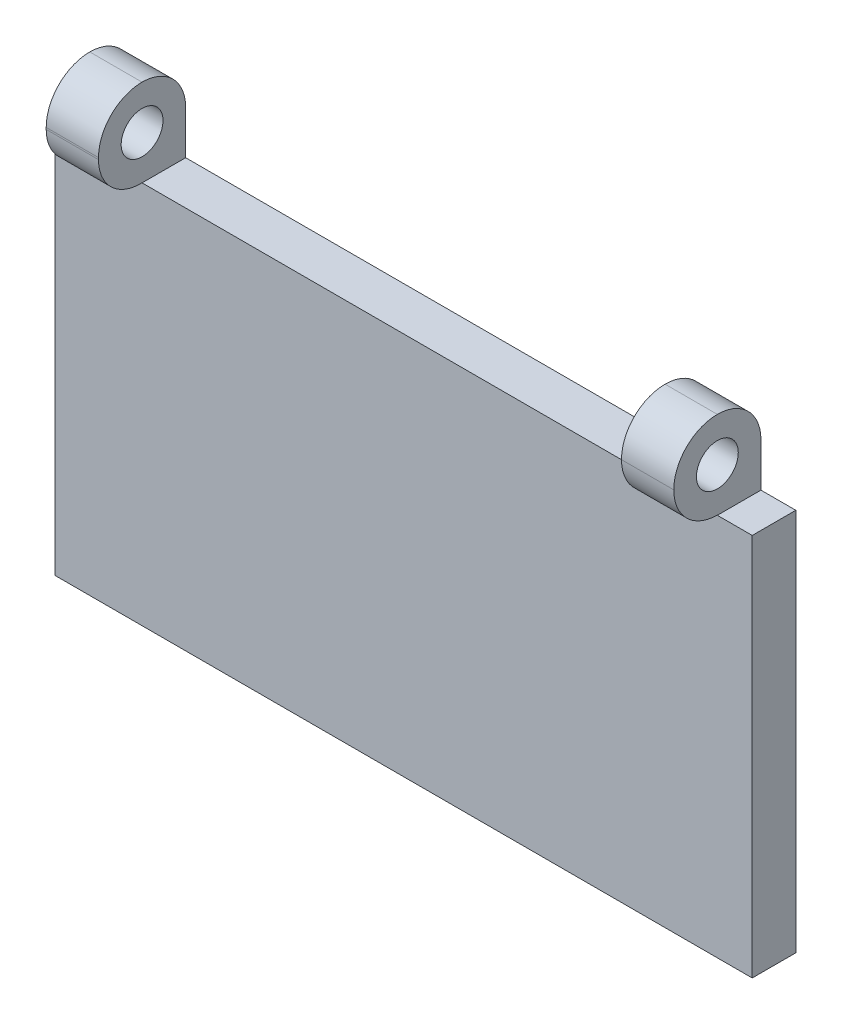
ISO-10303-21;
HEADER;
FILE_DESCRIPTION(('STEP AP214'),'2;1');
FILE_NAME('part.step','',(''),(''),'','','');
FILE_SCHEMA(('AUTOMOTIVE_DESIGN { 1 0 10303 214 1 1 1 1 }'));
ENDSEC;
DATA;
#1=APPLICATION_CONTEXT('core data for automotive mechanical design processes');
#2=APPLICATION_PROTOCOL_DEFINITION('international standard','automotive_design',2000,#1);
#3=PRODUCT_CONTEXT('',#1,'mechanical');
#4=PRODUCT('Part','Part','',(#3));
#5=PRODUCT_RELATED_PRODUCT_CATEGORY('part','',(#4));
#6=PRODUCT_DEFINITION_FORMATION('','',#4);
#7=PRODUCT_DEFINITION_CONTEXT('part definition',#1,'design');
#8=PRODUCT_DEFINITION('design','',#6,#7);
#9=PRODUCT_DEFINITION_SHAPE('','',#8);
#10=(LENGTH_UNIT() NAMED_UNIT(*) SI_UNIT(.MILLI.,.METRE.));
#11=(NAMED_UNIT(*) PLANE_ANGLE_UNIT() SI_UNIT($,.RADIAN.));
#12=(NAMED_UNIT(*) SI_UNIT($,.STERADIAN.) SOLID_ANGLE_UNIT());
#13=UNCERTAINTY_MEASURE_WITH_UNIT(LENGTH_MEASURE(1.E-05),#10,'distance_accuracy_value','');
#14=(GEOMETRIC_REPRESENTATION_CONTEXT(3) GLOBAL_UNCERTAINTY_ASSIGNED_CONTEXT((#13)) GLOBAL_UNIT_ASSIGNED_CONTEXT((#10,
#11,#12)) REPRESENTATION_CONTEXT('',''));
#15=CARTESIAN_POINT('',(0.,0.,0.));
#16=DIRECTION('',(0.,0.,1.));
#17=DIRECTION('',(1.,0.,0.));
#18=AXIS2_PLACEMENT_3D('',#15,#16,#17);
#19=CARTESIAN_POINT('',(18.,22.075,2.5));
#20=DIRECTION('',(-1.,0.,0.));
#21=DIRECTION('',(0.,0.,1.));
#22=AXIS2_PLACEMENT_3D('',#19,#20,#21);
#23=CYLINDRICAL_SURFACE('',#22,1.2);
#24=CARTESIAN_POINT('',(15.,22.075,2.5));
#25=DIRECTION('',(1.,0.,0.));
#26=DIRECTION('',(0.,0.,-1.));
#27=AXIS2_PLACEMENT_3D('',#24,#25,#26);
#28=CIRCLE('',#27,1.2);
#29=CARTESIAN_POINT('',(15.,22.075,1.3));
#30=VERTEX_POINT('',#29);
#31=EDGE_CURVE('E189',#30,#30,#28,.F.);
#32=ORIENTED_EDGE('',*,*,#31,.T.);
#33=EDGE_LOOP('',(#32));
#34=FACE_BOUND('',#33,.T.);
#35=CARTESIAN_POINT('',(18.,22.075,2.5));
#36=DIRECTION('',(1.,0.,0.));
#37=DIRECTION('',(0.,0.,-1.));
#38=AXIS2_PLACEMENT_3D('',#35,#36,#37);
#39=CIRCLE('',#38,1.2);
#40=CARTESIAN_POINT('',(18.,22.075,1.3));
#41=VERTEX_POINT('',#40);
#42=EDGE_CURVE('E299',#41,#41,#39,.F.);
#43=ORIENTED_EDGE('',*,*,#42,.F.);
#44=EDGE_LOOP('',(#43));
#45=FACE_BOUND('',#44,.T.);
#46=ADVANCED_FACE('F34',(#34,#45),#23,.F.);
#47=CARTESIAN_POINT('',(20.,22.075,2.5));
#48=DIRECTION('',(-1.,0.,0.));
#49=DIRECTION('',(0.,-1.,0.));
#50=AXIS2_PLACEMENT_3D('',#47,#48,#49);
#51=CYLINDRICAL_SURFACE('',#50,2.5);
#52=DIRECTION('',(-1.,0.,0.));
#53=VECTOR('',#52,1.);
#54=CARTESIAN_POINT('',(20.,24.575,2.5));
#55=LINE('',#54,#53);
#56=CARTESIAN_POINT('',(18.,24.575,2.5));
#57=VERTEX_POINT('',#56);
#58=CARTESIAN_POINT('',(15.,24.575,2.5));
#59=VERTEX_POINT('',#58);
#60=EDGE_CURVE('E226',#57,#59,#55,.T.);
#61=ORIENTED_EDGE('',*,*,#60,.F.);
#62=CARTESIAN_POINT('',(18.,22.075,2.5));
#63=DIRECTION('',(1.,0.,0.));
#64=DIRECTION('',(0.,0.,-1.));
#65=AXIS2_PLACEMENT_3D('',#62,#63,#64);
#66=CIRCLE('',#65,2.5);
#67=CARTESIAN_POINT('',(18.,22.075,0.));
#68=VERTEX_POINT('',#67);
#69=EDGE_CURVE('E310',#57,#68,#66,.F.);
#70=ORIENTED_EDGE('',*,*,#69,.T.);
#71=DIRECTION('',(-1.,0.,0.));
#72=VECTOR('',#71,1.);
#73=CARTESIAN_POINT('',(0.,22.075,0.));
#74=LINE('',#73,#72);
#75=CARTESIAN_POINT('',(15.,22.075,0.));
#76=VERTEX_POINT('',#75);
#77=EDGE_CURVE('E218',#76,#68,#74,.F.);
#78=ORIENTED_EDGE('',*,*,#77,.F.);
#79=CARTESIAN_POINT('',(15.,22.075,2.5));
#80=DIRECTION('',(1.,0.,0.));
#81=DIRECTION('',(0.,0.,-1.));
#82=AXIS2_PLACEMENT_3D('',#79,#80,#81);
#83=CIRCLE('',#82,2.5);
#84=EDGE_CURVE('E266',#59,#76,#83,.F.);
#85=ORIENTED_EDGE('',*,*,#84,.F.);
#86=EDGE_LOOP('',(#61,#70,#78,#85));
#87=FACE_BOUND('',#86,.T.);
#88=ADVANCED_FACE('F36',(#87),#51,.T.);
#89=CARTESIAN_POINT('',(20.,22.075,2.5));
#90=DIRECTION('',(-1.,0.,0.));
#91=DIRECTION('',(0.,-1.,0.));
#92=AXIS2_PLACEMENT_3D('',#89,#90,#91);
#93=CYLINDRICAL_SURFACE('',#92,2.5);
#94=DIRECTION('',(-1.,0.,0.));
#95=VECTOR('',#94,1.);
#96=CARTESIAN_POINT('',(20.,22.075,5.));
#97=LINE('',#96,#95);
#98=CARTESIAN_POINT('',(18.,22.075,5.));
#99=VERTEX_POINT('',#98);
#100=CARTESIAN_POINT('',(15.,22.075,5.));
#101=VERTEX_POINT('',#100);
#102=EDGE_CURVE('E227',#99,#101,#97,.T.);
#103=ORIENTED_EDGE('',*,*,#102,.F.);
#104=CARTESIAN_POINT('',(18.,22.075,2.5));
#105=DIRECTION('',(1.,0.,0.));
#106=DIRECTION('',(0.,0.,-1.));
#107=AXIS2_PLACEMENT_3D('',#104,#105,#106);
#108=CIRCLE('',#107,2.5);
#109=EDGE_CURVE('E313',#99,#57,#108,.F.);
#110=ORIENTED_EDGE('',*,*,#109,.T.);
#111=ORIENTED_EDGE('',*,*,#60,.T.);
#112=CARTESIAN_POINT('',(15.,22.075,2.5));
#113=DIRECTION('',(1.,0.,0.));
#114=DIRECTION('',(0.,0.,-1.));
#115=AXIS2_PLACEMENT_3D('',#112,#113,#114);
#116=CIRCLE('',#115,2.5);
#117=EDGE_CURVE('E195',#101,#59,#116,.F.);
#118=ORIENTED_EDGE('',*,*,#117,.F.);
#119=EDGE_LOOP('',(#103,#110,#111,#118));
#120=FACE_BOUND('',#119,.T.);
#121=ADVANCED_FACE('F421',(#120),#93,.T.);
#122=CARTESIAN_POINT('',(20.,22.075,2.5));
#123=DIRECTION('',(-1.,0.,0.));
#124=DIRECTION('',(0.,-1.,0.));
#125=AXIS2_PLACEMENT_3D('',#122,#123,#124);
#126=CYLINDRICAL_SURFACE('',#125,2.5);
#127=DIRECTION('',(-1.,0.,0.));
#128=VECTOR('',#127,1.);
#129=CARTESIAN_POINT('',(20.,19.575,2.5));
#130=LINE('',#129,#128);
#131=CARTESIAN_POINT('',(18.,19.575,2.5));
#132=VERTEX_POINT('',#131);
#133=CARTESIAN_POINT('',(15.,19.575,2.5));
#134=VERTEX_POINT('',#133);
#135=EDGE_CURVE('E251',#132,#134,#130,.T.);
#136=ORIENTED_EDGE('',*,*,#135,.F.);
#137=CARTESIAN_POINT('',(18.,22.075,2.5));
#138=DIRECTION('',(1.,0.,0.));
#139=DIRECTION('',(0.,0.,-1.));
#140=AXIS2_PLACEMENT_3D('',#137,#138,#139);
#141=CIRCLE('',#140,2.5);
#142=EDGE_CURVE('E210',#132,#99,#141,.F.);
#143=ORIENTED_EDGE('',*,*,#142,.T.);
#144=ORIENTED_EDGE('',*,*,#102,.T.);
#145=CARTESIAN_POINT('',(15.,22.075,2.5));
#146=DIRECTION('',(1.,0.,0.));
#147=DIRECTION('',(0.,0.,-1.));
#148=AXIS2_PLACEMENT_3D('',#145,#146,#147);
#149=CIRCLE('',#148,2.5);
#150=EDGE_CURVE('E206',#134,#101,#149,.F.);
#151=ORIENTED_EDGE('',*,*,#150,.F.);
#152=EDGE_LOOP('',(#136,#143,#144,#151));
#153=FACE_BOUND('',#152,.T.);
#154=ADVANCED_FACE('F426',(#153),#126,.T.);
#155=CARTESIAN_POINT('',(-18.,22.075,2.5));
#156=DIRECTION('',(1.,0.,0.));
#157=DIRECTION('',(0.,0.,-1.));
#158=AXIS2_PLACEMENT_3D('',#155,#156,#157);
#159=CIRCLE('',#158,1.2);
#160=CARTESIAN_POINT('',(-18.,22.075,1.3));
#161=VERTEX_POINT('',#160);
#162=EDGE_CURVE('E274',#161,#161,#159,.F.);
#163=ORIENTED_EDGE('',*,*,#162,.T.);
#164=EDGE_LOOP('',(#163));
#165=FACE_BOUND('',#164,.T.);
#166=CARTESIAN_POINT('',(-15.,22.075,2.5));
#167=DIRECTION('',(-1.,0.,0.));
#168=DIRECTION('',(0.,0.,1.));
#169=AXIS2_PLACEMENT_3D('',#166,#167,#168);
#170=CIRCLE('',#169,1.2);
#171=CARTESIAN_POINT('',(-15.,22.075,3.7));
#172=VERTEX_POINT('',#171);
#173=EDGE_CURVE('E229',#172,#172,#170,.F.);
#174=ORIENTED_EDGE('',*,*,#173,.T.);
#175=EDGE_LOOP('',(#174));
#176=FACE_BOUND('',#175,.T.);
#177=ADVANCED_FACE('F417',(#165,#176),#23,.F.);
#178=CARTESIAN_POINT('',(20.,-24.575,5.));
#179=DIRECTION('',(-1.,0.,0.));
#180=DIRECTION('',(0.,0.,1.));
#181=AXIS2_PLACEMENT_3D('',#178,#179,#180);
#182=PLANE('',#181);
#183=DIRECTION('',(0.,1.,0.));
#184=VECTOR('',#183,1.);
#185=CARTESIAN_POINT('',(20.,19.575,2.5));
#186=LINE('',#185,#184);
#187=CARTESIAN_POINT('',(20.,-2.4249997790061,2.5));
#188=VERTEX_POINT('',#187);
#189=CARTESIAN_POINT('',(20.,19.5610313809982,2.5));
#190=VERTEX_POINT('',#189);
#191=EDGE_CURVE('E246',#188,#190,#186,.T.);
#192=ORIENTED_EDGE('',*,*,#191,.F.);
#193=DIRECTION('',(0.,0.,-1.));
#194=VECTOR('',#193,1.);
#195=CARTESIAN_POINT('',(20.,-2.4249995580122,5.));
#196=LINE('',#195,#194);
#197=CARTESIAN_POINT('',(20.,-2.4249995580122,0.));
#198=VERTEX_POINT('',#197);
#199=EDGE_CURVE('E58',#188,#198,#196,.T.);
#200=ORIENTED_EDGE('',*,*,#199,.T.);
#201=DIRECTION('',(0.,1.,0.));
#202=VECTOR('',#201,1.);
#203=CARTESIAN_POINT('',(20.,-24.575,0.));
#204=LINE('',#203,#202);
#205=CARTESIAN_POINT('',(20.,19.5610313809982,0.));
#206=VERTEX_POINT('',#205);
#207=EDGE_CURVE('E235',#198,#206,#204,.T.);
#208=ORIENTED_EDGE('',*,*,#207,.T.);
#209=DIRECTION('',(0.,0.,-1.));
#210=VECTOR('',#209,1.);
#211=CARTESIAN_POINT('',(20.,19.5610313809982,0.));
#212=LINE('',#211,#210);
#213=EDGE_CURVE('E320',#190,#206,#212,.T.);
#214=ORIENTED_EDGE('',*,*,#213,.F.);
#215=EDGE_LOOP('',(#192,#200,#208,#214));
#216=FACE_BOUND('',#215,.T.);
#217=ADVANCED_FACE('F403',(#216),#182,.F.);
#218=CARTESIAN_POINT('',(-20.,-24.575,5.));
#219=DIRECTION('',(1.,0.,0.));
#220=DIRECTION('',(0.,0.,-1.));
#221=AXIS2_PLACEMENT_3D('',#218,#219,#220);
#222=PLANE('',#221);
#223=DIRECTION('',(0.,-1.,0.));
#224=VECTOR('',#223,1.);
#225=CARTESIAN_POINT('',(-20.,-24.575,0.));
#226=LINE('',#225,#224);
#227=CARTESIAN_POINT('',(-20.,19.5520831324848,0.));
#228=VERTEX_POINT('',#227);
#229=CARTESIAN_POINT('',(-19.9999997571599,-2.42500000000001,0.));
#230=VERTEX_POINT('',#229);
#231=EDGE_CURVE('E243',#228,#230,#226,.T.);
#232=ORIENTED_EDGE('',*,*,#231,.T.);
#233=DIRECTION('',(0.,0.,1.));
#234=VECTOR('',#233,1.);
#235=CARTESIAN_POINT('',(-19.9999997571599,-2.42500000000001,0.));
#236=LINE('',#235,#234);
#237=CARTESIAN_POINT('',(-19.9999997571599,-2.42500000000001,2.5));
#238=VERTEX_POINT('',#237);
#239=EDGE_CURVE('E327',#230,#238,#236,.T.);
#240=ORIENTED_EDGE('',*,*,#239,.T.);
#241=DIRECTION('',(0.,-1.,0.));
#242=VECTOR('',#241,1.);
#243=CARTESIAN_POINT('',(-19.9999995124092,19.575,2.5));
#244=LINE('',#243,#242);
#245=CARTESIAN_POINT('',(-20.,19.5520831324848,2.5));
#246=VERTEX_POINT('',#245);
#247=EDGE_CURVE('E248',#246,#238,#244,.T.);
#248=ORIENTED_EDGE('',*,*,#247,.F.);
#249=DIRECTION('',(0.,0.,1.));
#250=VECTOR('',#249,1.);
#251=CARTESIAN_POINT('',(-20.,19.5520831324848,0.));
#252=LINE('',#251,#250);
#253=EDGE_CURVE('E296',#228,#246,#252,.T.);
#254=ORIENTED_EDGE('',*,*,#253,.F.);
#255=EDGE_LOOP('',(#232,#240,#248,#254));
#256=FACE_BOUND('',#255,.T.);
#257=ADVANCED_FACE('F344',(#256),#222,.F.);
#258=CARTESIAN_POINT('',(0.,0.,0.));
#259=DIRECTION('',(0.,0.,1.));
#260=DIRECTION('',(1.,0.,0.));
#261=AXIS2_PLACEMENT_3D('',#258,#259,#260);
#262=PLANE('',#261);
#263=ORIENTED_EDGE('',*,*,#207,.F.);
#264=DIRECTION('',(-1.,-1.10496954212237E-08,0.));
#265=VECTOR('',#264,1.);
#266=CARTESIAN_POINT('',(-19.9999997571599,-2.42500000000001,0.));
#267=LINE('',#266,#265);
#268=EDGE_CURVE('E177',#198,#230,#267,.T.);
#269=ORIENTED_EDGE('',*,*,#268,.T.);
#270=ORIENTED_EDGE('',*,*,#231,.F.);
#271=DIRECTION('',(-1.,0.,0.));
#272=VECTOR('',#271,1.);
#273=CARTESIAN_POINT('',(-18.,19.5520831324848,0.));
#274=LINE('',#273,#272);
#275=CARTESIAN_POINT('',(-18.,19.5520831324848,0.));
#276=VERTEX_POINT('',#275);
#277=EDGE_CURVE('E292',#276,#228,#274,.T.);
#278=ORIENTED_EDGE('',*,*,#277,.F.);
#279=DIRECTION('',(0.,-1.,0.));
#280=VECTOR('',#279,1.);
#281=CARTESIAN_POINT('',(-18.,19.5520831324848,0.));
#282=LINE('',#281,#280);
#283=CARTESIAN_POINT('',(-18.,22.0799216405794,0.));
#284=VERTEX_POINT('',#283);
#285=EDGE_CURVE('E298',#284,#276,#282,.T.);
#286=ORIENTED_EDGE('',*,*,#285,.F.);
#287=DIRECTION('',(1.,0.,0.));
#288=VECTOR('',#287,1.);
#289=CARTESIAN_POINT('',(0.,22.0799216405794,0.));
#290=LINE('',#289,#288);
#291=CARTESIAN_POINT('',(-15.,22.0799216405794,0.));
#292=VERTEX_POINT('',#291);
#293=EDGE_CURVE('E215',#284,#292,#290,.T.);
#294=ORIENTED_EDGE('',*,*,#293,.T.);
#295=DIRECTION('',(0.,-1.,0.));
#296=VECTOR('',#295,1.);
#297=CARTESIAN_POINT('',(-15.,19.575,0.));
#298=LINE('',#297,#296);
#299=CARTESIAN_POINT('',(-15.,19.575,0.));
#300=VERTEX_POINT('',#299);
#301=EDGE_CURVE('E187',#292,#300,#298,.T.);
#302=ORIENTED_EDGE('',*,*,#301,.T.);
#303=DIRECTION('',(1.,0.,0.));
#304=VECTOR('',#303,1.);
#305=CARTESIAN_POINT('',(-15.,19.575,0.));
#306=LINE('',#305,#304);
#307=CARTESIAN_POINT('',(15.,19.575,0.));
#308=VERTEX_POINT('',#307);
#309=EDGE_CURVE('E273',#300,#308,#306,.T.);
#310=ORIENTED_EDGE('',*,*,#309,.T.);
#311=DIRECTION('',(0.,1.,0.));
#312=VECTOR('',#311,1.);
#313=CARTESIAN_POINT('',(15.,19.575,0.));
#314=LINE('',#313,#312);
#315=EDGE_CURVE('E276',#308,#76,#314,.T.);
#316=ORIENTED_EDGE('',*,*,#315,.T.);
#317=ORIENTED_EDGE('',*,*,#77,.T.);
#318=DIRECTION('',(0.,1.,0.));
#319=VECTOR('',#318,1.);
#320=CARTESIAN_POINT('',(18.,19.5610313809982,0.));
#321=LINE('',#320,#319);
#322=CARTESIAN_POINT('',(18.,19.5610313809982,0.));
#323=VERTEX_POINT('',#322);
#324=EDGE_CURVE('E323',#323,#68,#321,.T.);
#325=ORIENTED_EDGE('',*,*,#324,.F.);
#326=DIRECTION('',(1.,0.,0.));
#327=VECTOR('',#326,1.);
#328=CARTESIAN_POINT('',(18.,19.5610313809982,0.));
#329=LINE('',#328,#327);
#330=EDGE_CURVE('E316',#323,#206,#329,.T.);
#331=ORIENTED_EDGE('',*,*,#330,.T.);
#332=EDGE_LOOP('',(#263,#269,#270,#278,#286,#294,#302,#310,#316,#317,#325,#331));
#333=FACE_BOUND('',#332,.T.);
#334=ADVANCED_FACE('F340',(#333),#262,.F.);
#335=CARTESIAN_POINT('',(0.,0.,2.5));
#336=DIRECTION('',(0.,0.,1.));
#337=DIRECTION('',(1.,0.,0.));
#338=AXIS2_PLACEMENT_3D('',#335,#336,#337);
#339=PLANE('',#338);
#340=DIRECTION('',(-1.,-1.10496954212237E-08,0.));
#341=VECTOR('',#340,1.);
#342=CARTESIAN_POINT('',(2.67955089545523E-08,-2.42499977900611,2.5));
#343=LINE('',#342,#341);
#344=EDGE_CURVE('E12',#188,#238,#343,.T.);
#345=ORIENTED_EDGE('',*,*,#344,.F.);
#346=ORIENTED_EDGE('',*,*,#191,.T.);
#347=DIRECTION('',(1.,0.,0.));
#348=VECTOR('',#347,1.);
#349=CARTESIAN_POINT('',(0.,19.5610313809982,2.5));
#350=LINE('',#349,#348);
#351=CARTESIAN_POINT('',(18.,19.5610313809982,2.5));
#352=VERTEX_POINT('',#351);
#353=EDGE_CURVE('E43',#352,#190,#350,.T.);
#354=ORIENTED_EDGE('',*,*,#353,.F.);
#355=DIRECTION('',(0.,1.,0.));
#356=VECTOR('',#355,1.);
#357=CARTESIAN_POINT('',(18.,0.,2.5));
#358=LINE('',#357,#356);
#359=EDGE_CURVE('E307',#352,#132,#358,.T.);
#360=ORIENTED_EDGE('',*,*,#359,.T.);
#361=ORIENTED_EDGE('',*,*,#135,.T.);
#362=CARTESIAN_POINT('',(-15.,19.575,2.5));
#363=VERTEX_POINT('',#362);
#364=EDGE_CURVE('E253',#134,#363,#130,.T.);
#365=ORIENTED_EDGE('',*,*,#364,.T.);
#366=DIRECTION('',(0.,-1.,0.));
#367=VECTOR('',#366,1.);
#368=CARTESIAN_POINT('',(-15.,0.,2.5));
#369=LINE('',#368,#367);
#370=CARTESIAN_POINT('',(-15.,19.5799216405794,2.5));
#371=VERTEX_POINT('',#370);
#372=EDGE_CURVE('E258',#371,#363,#369,.T.);
#373=ORIENTED_EDGE('',*,*,#372,.F.);
#374=DIRECTION('',(-1.,0.,0.));
#375=VECTOR('',#374,1.);
#376=CARTESIAN_POINT('',(-20.,19.5799216405794,2.5));
#377=LINE('',#376,#375);
#378=CARTESIAN_POINT('',(-18.,19.5799216405794,2.5));
#379=VERTEX_POINT('',#378);
#380=EDGE_CURVE('E225',#371,#379,#377,.T.);
#381=ORIENTED_EDGE('',*,*,#380,.T.);
#382=DIRECTION('',(0.,1.,0.));
#383=VECTOR('',#382,1.);
#384=CARTESIAN_POINT('',(-18.,0.,2.5));
#385=LINE('',#384,#383);
#386=CARTESIAN_POINT('',(-18.,19.5520831324848,2.5));
#387=VERTEX_POINT('',#386);
#388=EDGE_CURVE('E283',#387,#379,#385,.T.);
#389=ORIENTED_EDGE('',*,*,#388,.F.);
#390=DIRECTION('',(1.,0.,0.));
#391=VECTOR('',#390,1.);
#392=CARTESIAN_POINT('',(0.,19.5520831324848,2.5));
#393=LINE('',#392,#391);
#394=EDGE_CURVE('E213',#246,#387,#393,.T.);
#395=ORIENTED_EDGE('',*,*,#394,.F.);
#396=ORIENTED_EDGE('',*,*,#247,.T.);
#397=EDGE_LOOP('',(#345,#346,#354,#360,#361,#365,#373,#381,#389,#395,#396));
#398=FACE_BOUND('',#397,.T.);
#399=ADVANCED_FACE('F352',(#398),#339,.T.);
#400=CARTESIAN_POINT('',(-20.,19.5799216405794,0.));
#401=DIRECTION('',(0.,1.,0.));
#402=DIRECTION('',(-1.,0.,0.));
#403=AXIS2_PLACEMENT_3D('',#400,#401,#402);
#404=PLANE('',#403);
#405=DIRECTION('',(1.,0.,0.));
#406=VECTOR('',#405,1.);
#407=CARTESIAN_POINT('',(-20.,19.5799216405794,2.6));
#408=LINE('',#407,#406);
#409=CARTESIAN_POINT('',(-15.,19.5799216405794,2.6));
#410=VERTEX_POINT('',#409);
#411=CARTESIAN_POINT('',(-18.,19.5799216405794,2.6));
#412=VERTEX_POINT('',#411);
#413=EDGE_CURVE('E238',#410,#412,#408,.F.);
#414=ORIENTED_EDGE('',*,*,#413,.T.);
#415=DIRECTION('',(0.,0.,-1.));
#416=VECTOR('',#415,1.);
#417=CARTESIAN_POINT('',(-18.,19.5799216405794,0.));
#418=LINE('',#417,#416);
#419=EDGE_CURVE('E285',#412,#379,#418,.T.);
#420=ORIENTED_EDGE('',*,*,#419,.T.);
#421=ORIENTED_EDGE('',*,*,#380,.F.);
#422=DIRECTION('',(0.,0.,1.));
#423=VECTOR('',#422,1.);
#424=CARTESIAN_POINT('',(-15.,19.5799216405794,0.));
#425=LINE('',#424,#423);
#426=EDGE_CURVE('E260',#371,#410,#425,.T.);
#427=ORIENTED_EDGE('',*,*,#426,.T.);
#428=EDGE_LOOP('',(#414,#420,#421,#427));
#429=FACE_BOUND('',#428,.T.);
#430=ADVANCED_FACE('F360',(#429),#404,.F.);
#431=CARTESIAN_POINT('',(-20.,19.5799216405794,5.));
#432=DIRECTION('',(0.,0.,-1.));
#433=DIRECTION('',(-1.,0.,0.));
#434=AXIS2_PLACEMENT_3D('',#431,#432,#433);
#435=PLANE('',#434);
#436=DIRECTION('',(1.,0.,0.));
#437=VECTOR('',#436,1.);
#438=CARTESIAN_POINT('',(-20.,22.0799216405794,5.));
#439=LINE('',#438,#437);
#440=CARTESIAN_POINT('',(-15.,22.0799216405794,5.));
#441=VERTEX_POINT('',#440);
#442=CARTESIAN_POINT('',(-18.,22.0799216405794,5.));
#443=VERTEX_POINT('',#442);
#444=EDGE_CURVE('E232',#441,#443,#439,.F.);
#445=ORIENTED_EDGE('',*,*,#444,.T.);
#446=DIRECTION('',(0.,1.,0.));
#447=VECTOR('',#446,1.);
#448=CARTESIAN_POINT('',(-18.,19.5520831324848,5.));
#449=LINE('',#448,#447);
#450=CARTESIAN_POINT('',(-18.,21.9799216405794,5.));
#451=VERTEX_POINT('',#450);
#452=EDGE_CURVE('E295',#451,#443,#449,.T.);
#453=ORIENTED_EDGE('',*,*,#452,.F.);
#454=DIRECTION('',(1.,0.,0.));
#455=VECTOR('',#454,1.);
#456=CARTESIAN_POINT('',(-20.,21.9799216405794,5.));
#457=LINE('',#456,#455);
#458=CARTESIAN_POINT('',(-15.,21.9799216405794,5.));
#459=VERTEX_POINT('',#458);
#460=EDGE_CURVE('E234',#451,#459,#457,.T.);
#461=ORIENTED_EDGE('',*,*,#460,.T.);
#462=DIRECTION('',(0.,-1.,0.));
#463=VECTOR('',#462,1.);
#464=CARTESIAN_POINT('',(-15.,19.575,5.));
#465=LINE('',#464,#463);
#466=EDGE_CURVE('E270',#441,#459,#465,.T.);
#467=ORIENTED_EDGE('',*,*,#466,.F.);
#468=EDGE_LOOP('',(#445,#453,#461,#467));
#469=FACE_BOUND('',#468,.T.);
#470=ADVANCED_FACE('F370',(#469),#435,.F.);
#471=CARTESIAN_POINT('',(-20.,21.9799216405794,2.6));
#472=DIRECTION('',(1.,0.,0.));
#473=DIRECTION('',(0.,1.,0.));
#474=AXIS2_PLACEMENT_3D('',#471,#472,#473);
#475=CYLINDRICAL_SURFACE('',#474,2.4);
#476=CARTESIAN_POINT('',(-18.,21.9799216405794,2.6));
#477=DIRECTION('',(1.,0.,0.));
#478=DIRECTION('',(0.,0.,-1.));
#479=AXIS2_PLACEMENT_3D('',#476,#477,#478);
#480=CIRCLE('',#479,2.4);
#481=EDGE_CURVE('E288',#412,#451,#480,.F.);
#482=ORIENTED_EDGE('',*,*,#481,.F.);
#483=ORIENTED_EDGE('',*,*,#413,.F.);
#484=CARTESIAN_POINT('',(-15.,21.9799216405794,2.6));
#485=DIRECTION('',(-1.,0.,0.));
#486=DIRECTION('',(0.,0.,1.));
#487=AXIS2_PLACEMENT_3D('',#484,#485,#486);
#488=CIRCLE('',#487,2.4);
#489=EDGE_CURVE('E188',#459,#410,#488,.F.);
#490=ORIENTED_EDGE('',*,*,#489,.F.);
#491=ORIENTED_EDGE('',*,*,#460,.F.);
#492=EDGE_LOOP('',(#482,#483,#490,#491));
#493=FACE_BOUND('',#492,.T.);
#494=ADVANCED_FACE('F364',(#493),#475,.T.);
#495=CARTESIAN_POINT('',(0.,22.0799216405794,2.5));
#496=DIRECTION('',(1.,0.,0.));
#497=DIRECTION('',(0.,1.,0.));
#498=AXIS2_PLACEMENT_3D('',#495,#496,#497);
#499=CYLINDRICAL_SURFACE('',#498,2.5);
#500=CARTESIAN_POINT('',(-14.9999620086021,22.0799216405794,2.5));
#501=DIRECTION('',(-1.,0.,0.));
#502=DIRECTION('',(0.,-1.,0.));
#503=AXIS2_PLACEMENT_3D('',#500,#501,#502);
#504=CIRCLE('',#503,2.5);
#505=CARTESIAN_POINT('',(-14.9999645086021,24.575,2.34320720567873));
#506=VERTEX_POINT('',#505);
#507=CARTESIAN_POINT('',(-14.9999620086021,24.5799216405794,2.5));
#508=VERTEX_POINT('',#507);
#509=EDGE_CURVE('E164',#506,#508,#504,.F.);
#510=ORIENTED_EDGE('',*,*,#509,.F.);
#511=CARTESIAN_POINT('',(-15.,22.0799216405794,2.5));
#512=DIRECTION('',(-1.,0.,0.));
#513=DIRECTION('',(0.,0.,1.));
#514=AXIS2_PLACEMENT_3D('',#511,#512,#513);
#515=CIRCLE('',#514,2.5);
#516=EDGE_CURVE('E174',#292,#506,#515,.F.);
#517=ORIENTED_EDGE('',*,*,#516,.F.);
#518=ORIENTED_EDGE('',*,*,#293,.F.);
#519=CARTESIAN_POINT('',(-18.,22.0799216405794,2.5));
#520=DIRECTION('',(1.,0.,0.));
#521=DIRECTION('',(0.,0.,-1.));
#522=AXIS2_PLACEMENT_3D('',#519,#520,#521);
#523=CIRCLE('',#522,2.5);
#524=CARTESIAN_POINT('',(-18.,24.5799216405794,2.5));
#525=VERTEX_POINT('',#524);
#526=EDGE_CURVE('E290',#525,#284,#523,.F.);
#527=ORIENTED_EDGE('',*,*,#526,.F.);
#528=DIRECTION('',(1.,0.,0.));
#529=VECTOR('',#528,1.);
#530=CARTESIAN_POINT('',(-20.,24.5799216405794,2.5));
#531=LINE('',#530,#529);
#532=EDGE_CURVE('E176',#508,#525,#531,.F.);
#533=ORIENTED_EDGE('',*,*,#532,.F.);
#534=EDGE_LOOP('',(#510,#517,#518,#527,#533));
#535=FACE_BOUND('',#534,.T.);
#536=ADVANCED_FACE('F172',(#535),#499,.T.);
#537=CARTESIAN_POINT('',(-20.,22.0799216405794,2.5));
#538=DIRECTION('',(1.,0.,0.));
#539=DIRECTION('',(0.,1.,0.));
#540=AXIS2_PLACEMENT_3D('',#537,#538,#539);
#541=CYLINDRICAL_SURFACE('',#540,2.5);
#542=CARTESIAN_POINT('',(-14.9999620086021,22.0799216405794,2.5));
#543=DIRECTION('',(-1.,0.,0.));
#544=DIRECTION('',(0.,-1.,0.));
#545=AXIS2_PLACEMENT_3D('',#542,#543,#544);
#546=CIRCLE('',#545,2.5);
#547=CARTESIAN_POINT('',(-14.9999645086021,24.575,2.65679279432119));
#548=VERTEX_POINT('',#547);
#549=EDGE_CURVE('E51',#508,#548,#546,.F.);
#550=ORIENTED_EDGE('',*,*,#549,.F.);
#551=ORIENTED_EDGE('',*,*,#532,.T.);
#552=CARTESIAN_POINT('',(-18.,22.0799216405794,2.5));
#553=DIRECTION('',(1.,0.,0.));
#554=DIRECTION('',(0.,0.,-1.));
#555=AXIS2_PLACEMENT_3D('',#552,#553,#554);
#556=CIRCLE('',#555,2.5);
#557=EDGE_CURVE('E205',#443,#525,#556,.F.);
#558=ORIENTED_EDGE('',*,*,#557,.F.);
#559=ORIENTED_EDGE('',*,*,#444,.F.);
#560=CARTESIAN_POINT('',(-15.,22.0799216405794,2.5));
#561=DIRECTION('',(-1.,0.,0.));
#562=DIRECTION('',(0.,0.,1.));
#563=AXIS2_PLACEMENT_3D('',#560,#561,#562);
#564=CIRCLE('',#563,2.5);
#565=EDGE_CURVE('E204',#548,#441,#564,.F.);
#566=ORIENTED_EDGE('',*,*,#565,.F.);
#567=EDGE_LOOP('',(#550,#551,#558,#559,#566));
#568=FACE_BOUND('',#567,.T.);
#569=ADVANCED_FACE('F374',(#568),#541,.T.);
#570=CARTESIAN_POINT('',(-15.,19.575,0.));
#571=DIRECTION('',(-1.,0.,0.));
#572=DIRECTION('',(0.,0.,1.));
#573=AXIS2_PLACEMENT_3D('',#570,#571,#572);
#574=PLANE('',#573);
#575=ORIENTED_EDGE('',*,*,#372,.T.);
#576=DIRECTION('',(0.,0.,1.));
#577=VECTOR('',#576,1.);
#578=CARTESIAN_POINT('',(-15.,19.575,0.));
#579=LINE('',#578,#577);
#580=EDGE_CURVE('E191',#300,#363,#579,.T.);
#581=ORIENTED_EDGE('',*,*,#580,.F.);
#582=ORIENTED_EDGE('',*,*,#301,.F.);
#583=ORIENTED_EDGE('',*,*,#516,.T.);
#584=DIRECTION('',(0.,0.,1.));
#585=VECTOR('',#584,1.);
#586=CARTESIAN_POINT('',(-15.,24.575,0.));
#587=LINE('',#586,#585);
#588=EDGE_CURVE('E185',#506,#548,#587,.T.);
#589=ORIENTED_EDGE('',*,*,#588,.T.);
#590=ORIENTED_EDGE('',*,*,#565,.T.);
#591=ORIENTED_EDGE('',*,*,#466,.T.);
#592=ORIENTED_EDGE('',*,*,#489,.T.);
#593=ORIENTED_EDGE('',*,*,#426,.F.);
#594=EDGE_LOOP('',(#575,#581,#582,#583,#589,#590,#591,#592,#593));
#595=FACE_BOUND('',#594,.T.);
#596=ORIENTED_EDGE('',*,*,#173,.F.);
#597=EDGE_LOOP('',(#596));
#598=FACE_BOUND('',#597,.T.);
#599=ADVANCED_FACE('F183',(#595,#598),#574,.F.);
#600=CARTESIAN_POINT('',(-15.,24.575,0.));
#601=DIRECTION('',(0.,1.,0.));
#602=DIRECTION('',(-1.,0.,0.));
#603=AXIS2_PLACEMENT_3D('',#600,#601,#602);
#604=PLANE('',#603);
#605=ORIENTED_EDGE('',*,*,#588,.F.);
#606=DIRECTION('',(0.,0.,-1.));
#607=VECTOR('',#606,1.);
#608=CARTESIAN_POINT('',(-14.9999620086021,24.575,2.65679279432119));
#609=LINE('',#608,#607);
#610=EDGE_CURVE('E161',#548,#506,#609,.T.);
#611=ORIENTED_EDGE('',*,*,#610,.F.);
#612=EDGE_LOOP('',(#605,#611));
#613=FACE_BOUND('',#612,.T.);
#614=ADVANCED_FACE('F190',(#613),#604,.F.);
#615=CARTESIAN_POINT('',(15.,19.575,0.));
#616=DIRECTION('',(1.,0.,0.));
#617=DIRECTION('',(0.,0.,-1.));
#618=AXIS2_PLACEMENT_3D('',#615,#616,#617);
#619=PLANE('',#618);
#620=ORIENTED_EDGE('',*,*,#84,.T.);
#621=ORIENTED_EDGE('',*,*,#315,.F.);
#622=DIRECTION('',(0.,0.,1.));
#623=VECTOR('',#622,1.);
#624=CARTESIAN_POINT('',(15.,19.575,0.));
#625=LINE('',#624,#623);
#626=EDGE_CURVE('E192',#308,#134,#625,.T.);
#627=ORIENTED_EDGE('',*,*,#626,.T.);
#628=ORIENTED_EDGE('',*,*,#150,.T.);
#629=ORIENTED_EDGE('',*,*,#117,.T.);
#630=EDGE_LOOP('',(#620,#621,#627,#628,#629));
#631=FACE_BOUND('',#630,.T.);
#632=ORIENTED_EDGE('',*,*,#31,.F.);
#633=EDGE_LOOP('',(#632));
#634=FACE_BOUND('',#633,.T.);
#635=ADVANCED_FACE('F385',(#631,#634),#619,.F.);
#636=CARTESIAN_POINT('',(-15.,19.575,0.));
#637=DIRECTION('',(0.,-1.,0.));
#638=DIRECTION('',(1.,0.,0.));
#639=AXIS2_PLACEMENT_3D('',#636,#637,#638);
#640=PLANE('',#639);
#641=ORIENTED_EDGE('',*,*,#580,.T.);
#642=ORIENTED_EDGE('',*,*,#364,.F.);
#643=ORIENTED_EDGE('',*,*,#626,.F.);
#644=ORIENTED_EDGE('',*,*,#309,.F.);
#645=EDGE_LOOP('',(#641,#642,#643,#644));
#646=FACE_BOUND('',#645,.T.);
#647=ADVANCED_FACE('F381',(#646),#640,.F.);
#648=CARTESIAN_POINT('',(-18.,0.,0.));
#649=DIRECTION('',(1.,0.,0.));
#650=DIRECTION('',(0.,0.,-1.));
#651=AXIS2_PLACEMENT_3D('',#648,#649,#650);
#652=PLANE('',#651);
#653=ORIENTED_EDGE('',*,*,#388,.T.);
#654=ORIENTED_EDGE('',*,*,#419,.F.);
#655=ORIENTED_EDGE('',*,*,#481,.T.);
#656=ORIENTED_EDGE('',*,*,#452,.T.);
#657=ORIENTED_EDGE('',*,*,#557,.T.);
#658=ORIENTED_EDGE('',*,*,#526,.T.);
#659=ORIENTED_EDGE('',*,*,#285,.T.);
#660=DIRECTION('',(0.,0.,1.));
#661=VECTOR('',#660,1.);
#662=CARTESIAN_POINT('',(-18.,19.5520831324848,0.));
#663=LINE('',#662,#661);
#664=EDGE_CURVE('E301',#276,#387,#663,.T.);
#665=ORIENTED_EDGE('',*,*,#664,.T.);
#666=EDGE_LOOP('',(#653,#654,#655,#656,#657,#658,#659,#665));
#667=FACE_BOUND('',#666,.T.);
#668=ORIENTED_EDGE('',*,*,#162,.F.);
#669=EDGE_LOOP('',(#668));
#670=FACE_BOUND('',#669,.T.);
#671=ADVANCED_FACE('F356',(#667,#670),#652,.F.);
#672=CARTESIAN_POINT('',(-18.,19.5520831324848,0.));
#673=DIRECTION('',(0.,-1.,0.));
#674=DIRECTION('',(0.,0.,-1.));
#675=AXIS2_PLACEMENT_3D('',#672,#673,#674);
#676=PLANE('',#675);
#677=ORIENTED_EDGE('',*,*,#394,.T.);
#678=ORIENTED_EDGE('',*,*,#664,.F.);
#679=ORIENTED_EDGE('',*,*,#277,.T.);
#680=ORIENTED_EDGE('',*,*,#253,.T.);
#681=EDGE_LOOP('',(#677,#678,#679,#680));
#682=FACE_BOUND('',#681,.T.);
#683=ADVANCED_FACE('F348',(#682),#676,.F.);
#684=CARTESIAN_POINT('',(18.,0.,0.));
#685=DIRECTION('',(1.,0.,0.));
#686=DIRECTION('',(0.,0.,-1.));
#687=AXIS2_PLACEMENT_3D('',#684,#685,#686);
#688=PLANE('',#687);
#689=DIRECTION('',(0.,0.,-1.));
#690=VECTOR('',#689,1.);
#691=CARTESIAN_POINT('',(18.,19.5610313809982,0.));
#692=LINE('',#691,#690);
#693=EDGE_CURVE('E319',#352,#323,#692,.T.);
#694=ORIENTED_EDGE('',*,*,#693,.T.);
#695=ORIENTED_EDGE('',*,*,#324,.T.);
#696=ORIENTED_EDGE('',*,*,#69,.F.);
#697=ORIENTED_EDGE('',*,*,#109,.F.);
#698=ORIENTED_EDGE('',*,*,#142,.F.);
#699=ORIENTED_EDGE('',*,*,#359,.F.);
#700=EDGE_LOOP('',(#694,#695,#696,#697,#698,#699));
#701=FACE_BOUND('',#700,.T.);
#702=ORIENTED_EDGE('',*,*,#42,.T.);
#703=EDGE_LOOP('',(#702));
#704=FACE_BOUND('',#703,.T.);
#705=ADVANCED_FACE('F394',(#701,#704),#688,.T.);
#706=CARTESIAN_POINT('',(18.,19.5610313809982,0.));
#707=DIRECTION('',(0.,-1.,0.));
#708=DIRECTION('',(0.,0.,-1.));
#709=AXIS2_PLACEMENT_3D('',#706,#707,#708);
#710=PLANE('',#709);
#711=ORIENTED_EDGE('',*,*,#353,.T.);
#712=ORIENTED_EDGE('',*,*,#213,.T.);
#713=ORIENTED_EDGE('',*,*,#330,.F.);
#714=ORIENTED_EDGE('',*,*,#693,.F.);
#715=EDGE_LOOP('',(#711,#712,#713,#714));
#716=FACE_BOUND('',#715,.T.);
#717=ADVANCED_FACE('F399',(#716),#710,.F.);
#718=CARTESIAN_POINT('',(-19.9999997571599,-2.42500000000001,0.));
#719=DIRECTION('',(-1.10496954212237E-08,1.,0.));
#720=DIRECTION('',(-1.,-1.10496954212237E-08,0.));
#721=AXIS2_PLACEMENT_3D('',#718,#719,#720);
#722=PLANE('',#721);
#723=ORIENTED_EDGE('',*,*,#344,.T.);
#724=ORIENTED_EDGE('',*,*,#239,.F.);
#725=ORIENTED_EDGE('',*,*,#268,.F.);
#726=ORIENTED_EDGE('',*,*,#199,.F.);
#727=EDGE_LOOP('',(#723,#724,#725,#726));
#728=FACE_BOUND('',#727,.T.);
#729=ADVANCED_FACE('F404',(#728),#722,.F.);
#730=CARTESIAN_POINT('',(-14.9999620086021,24.625,2.65679279432119));
#731=DIRECTION('',(-1.,0.,0.));
#732=DIRECTION('',(0.,-1.,0.));
#733=AXIS2_PLACEMENT_3D('',#730,#731,#732);
#734=PLANE('',#733);
#735=ORIENTED_EDGE('',*,*,#509,.T.);
#736=ORIENTED_EDGE('',*,*,#549,.T.);
#737=ORIENTED_EDGE('',*,*,#610,.T.);
#738=EDGE_LOOP('',(#735,#736,#737));
#739=FACE_BOUND('',#738,.T.);
#740=ADVANCED_FACE('F163',(#739),#734,.F.);
#741=CLOSED_SHELL('',(#46,#88,#121,#154,#177,#217,#257,#334,#399,#430,#470,#494,#536,#569,#599,
#614,#635,#647,#671,#683,#705,#717,#729,#740));
#742=MANIFOLD_SOLID_BREP('B2',#741);
#743=ADVANCED_BREP_SHAPE_REPRESENTATION('',(#18,#742),#14);
#744=SHAPE_DEFINITION_REPRESENTATION(#9,#743);
ENDSEC;
END-ISO-10303-21;
